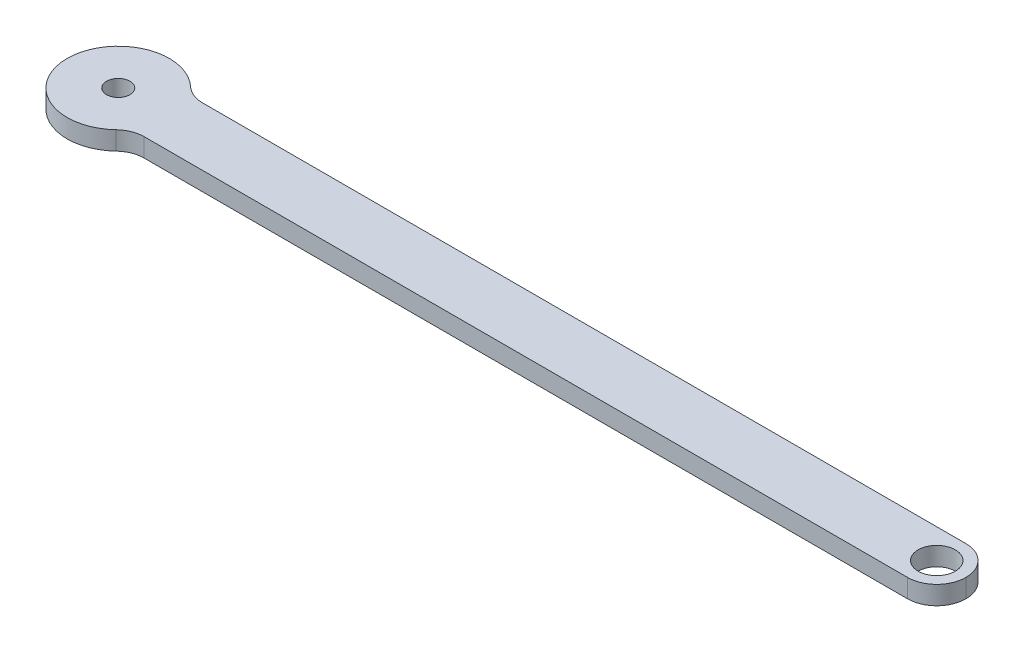
ISO-10303-21;
HEADER;
FILE_DESCRIPTION(('STEP AP214'),'2;1');
FILE_NAME('part.step','',(''),(''),'','','');
FILE_SCHEMA(('AUTOMOTIVE_DESIGN { 1 0 10303 214 1 1 1 1 }'));
ENDSEC;
DATA;
#1=APPLICATION_CONTEXT('core data for automotive mechanical design processes');
#2=APPLICATION_PROTOCOL_DEFINITION('international standard','automotive_design',2000,#1);
#3=PRODUCT_CONTEXT('',#1,'mechanical');
#4=PRODUCT('Part','Part','',(#3));
#5=PRODUCT_RELATED_PRODUCT_CATEGORY('part','',(#4));
#6=PRODUCT_DEFINITION_FORMATION('','',#4);
#7=PRODUCT_DEFINITION_CONTEXT('part definition',#1,'design');
#8=PRODUCT_DEFINITION('design','',#6,#7);
#9=PRODUCT_DEFINITION_SHAPE('','',#8);
#10=(LENGTH_UNIT() NAMED_UNIT(*) SI_UNIT(.MILLI.,.METRE.));
#11=(NAMED_UNIT(*) PLANE_ANGLE_UNIT() SI_UNIT($,.RADIAN.));
#12=(NAMED_UNIT(*) SI_UNIT($,.STERADIAN.) SOLID_ANGLE_UNIT());
#13=UNCERTAINTY_MEASURE_WITH_UNIT(LENGTH_MEASURE(1.E-05),#10,'distance_accuracy_value','');
#14=(GEOMETRIC_REPRESENTATION_CONTEXT(3) GLOBAL_UNCERTAINTY_ASSIGNED_CONTEXT((#13)) GLOBAL_UNIT_ASSIGNED_CONTEXT((#10,
#11,#12)) REPRESENTATION_CONTEXT('',''));
#15=CARTESIAN_POINT('',(0.,0.,0.));
#16=DIRECTION('',(0.,0.,1.));
#17=DIRECTION('',(1.,0.,0.));
#18=AXIS2_PLACEMENT_3D('',#15,#16,#17);
#19=CARTESIAN_POINT('',(-150.,6.35,10.));
#20=DIRECTION('',(0.,0.,-1.));
#21=DIRECTION('',(-1.,0.,0.));
#22=AXIS2_PLACEMENT_3D('',#19,#20,#21);
#23=PLANE('',#22);
#24=DIRECTION('',(1.,0.,0.));
#25=VECTOR('',#24,1.);
#26=CARTESIAN_POINT('',(-150.,6.35,10.));
#27=LINE('',#26,#25);
#28=CARTESIAN_POINT('',(-121.125413911823,6.35,10.));
#29=VERTEX_POINT('',#28);
#30=CARTESIAN_POINT('',(140.,6.35,10.));
#31=VERTEX_POINT('',#30);
#32=EDGE_CURVE('E126',#29,#31,#27,.T.);
#33=ORIENTED_EDGE('',*,*,#32,.F.);
#34=DIRECTION('',(0.,1.,0.));
#35=VECTOR('',#34,1.);
#36=CARTESIAN_POINT('',(-121.125413911823,6.35,10.));
#37=LINE('',#36,#35);
#38=CARTESIAN_POINT('',(-121.125413911823,0.,10.));
#39=VERTEX_POINT('',#38);
#40=EDGE_CURVE('E141',#29,#39,#37,.F.);
#41=ORIENTED_EDGE('',*,*,#40,.T.);
#42=DIRECTION('',(1.,0.,0.));
#43=VECTOR('',#42,1.);
#44=CARTESIAN_POINT('',(-150.,0.,10.));
#45=LINE('',#44,#43);
#46=CARTESIAN_POINT('',(140.,0.,10.));
#47=VERTEX_POINT('',#46);
#48=EDGE_CURVE('E127',#39,#47,#45,.T.);
#49=ORIENTED_EDGE('',*,*,#48,.T.);
#50=DIRECTION('',(0.,-1.,0.));
#51=VECTOR('',#50,1.);
#52=CARTESIAN_POINT('',(140.,6.35,10.));
#53=LINE('',#52,#51);
#54=EDGE_CURVE('E138',#47,#31,#53,.F.);
#55=ORIENTED_EDGE('',*,*,#54,.T.);
#56=EDGE_LOOP('',(#33,#41,#49,#55));
#57=FACE_BOUND('',#56,.T.);
#58=ADVANCED_FACE('F45',(#57),#23,.F.);
#59=CARTESIAN_POINT('',(-150.,6.35,-10.));
#60=DIRECTION('',(0.,0.,1.));
#61=DIRECTION('',(1.,0.,0.));
#62=AXIS2_PLACEMENT_3D('',#59,#60,#61);
#63=PLANE('',#62);
#64=DIRECTION('',(-1.,0.,0.));
#65=VECTOR('',#64,1.);
#66=CARTESIAN_POINT('',(-150.,0.,-10.));
#67=LINE('',#66,#65);
#68=CARTESIAN_POINT('',(140.,0.,-10.));
#69=VERTEX_POINT('',#68);
#70=CARTESIAN_POINT('',(-121.125413911823,0.,-10.));
#71=VERTEX_POINT('',#70);
#72=EDGE_CURVE('E118',#69,#71,#67,.T.);
#73=ORIENTED_EDGE('',*,*,#72,.T.);
#74=DIRECTION('',(0.,1.,0.));
#75=VECTOR('',#74,1.);
#76=CARTESIAN_POINT('',(-121.125413911823,6.35,-10.));
#77=LINE('',#76,#75);
#78=CARTESIAN_POINT('',(-121.125413911823,6.35,-10.));
#79=VERTEX_POINT('',#78);
#80=EDGE_CURVE('E151',#71,#79,#77,.T.);
#81=ORIENTED_EDGE('',*,*,#80,.T.);
#82=DIRECTION('',(-1.,0.,0.));
#83=VECTOR('',#82,1.);
#84=CARTESIAN_POINT('',(-150.,6.35,-10.));
#85=LINE('',#84,#83);
#86=CARTESIAN_POINT('',(140.,6.35,-10.));
#87=VERTEX_POINT('',#86);
#88=EDGE_CURVE('E120',#87,#79,#85,.T.);
#89=ORIENTED_EDGE('',*,*,#88,.F.);
#90=DIRECTION('',(0.,-1.,0.));
#91=VECTOR('',#90,1.);
#92=CARTESIAN_POINT('',(140.,6.35,-10.));
#93=LINE('',#92,#91);
#94=EDGE_CURVE('E108',#87,#69,#93,.T.);
#95=ORIENTED_EDGE('',*,*,#94,.T.);
#96=EDGE_LOOP('',(#73,#81,#89,#95));
#97=FACE_BOUND('',#96,.T.);
#98=ADVANCED_FACE('F117',(#97),#63,.F.);
#99=CARTESIAN_POINT('',(0.,6.35,0.));
#100=DIRECTION('',(0.,1.,0.));
#101=DIRECTION('',(0.,0.,1.));
#102=AXIS2_PLACEMENT_3D('',#99,#100,#101);
#103=PLANE('',#102);
#104=ORIENTED_EDGE('',*,*,#88,.T.);
#105=CARTESIAN_POINT('',(-121.125413911823,6.35,-20.));
#106=DIRECTION('',(0.,1.,0.));
#107=DIRECTION('',(0.,0.,1.));
#108=AXIS2_PLACEMENT_3D('',#105,#106,#107);
#109=CIRCLE('',#108,10.);
#110=CARTESIAN_POINT('',(-127.988899762069,6.35,-12.7272727272727));
#111=VERTEX_POINT('',#110);
#112=EDGE_CURVE('E53',#79,#111,#109,.F.);
#113=ORIENTED_EDGE('',*,*,#112,.T.);
#114=CARTESIAN_POINT('',(-140.,6.35,0.));
#115=DIRECTION('',(0.,1.,0.));
#116=DIRECTION('',(0.,0.,1.));
#117=AXIS2_PLACEMENT_3D('',#114,#115,#116);
#118=CIRCLE('',#117,17.5);
#119=CARTESIAN_POINT('',(-127.988899762069,6.35,12.7272727272727));
#120=VERTEX_POINT('',#119);
#121=EDGE_CURVE('E161',#111,#120,#118,.T.);
#122=ORIENTED_EDGE('',*,*,#121,.T.);
#123=CARTESIAN_POINT('',(-121.125413911823,6.35,20.));
#124=DIRECTION('',(0.,1.,0.));
#125=DIRECTION('',(0.,0.,1.));
#126=AXIS2_PLACEMENT_3D('',#123,#124,#125);
#127=CIRCLE('',#126,10.);
#128=EDGE_CURVE('E155',#120,#29,#127,.F.);
#129=ORIENTED_EDGE('',*,*,#128,.T.);
#130=ORIENTED_EDGE('',*,*,#32,.T.);
#131=CARTESIAN_POINT('',(140.,6.35,0.));
#132=DIRECTION('',(0.,1.,0.));
#133=DIRECTION('',(0.,0.,1.));
#134=AXIS2_PLACEMENT_3D('',#131,#132,#133);
#135=CIRCLE('',#134,10.);
#136=CARTESIAN_POINT('',(150.,6.35,0.));
#137=VERTEX_POINT('',#136);
#138=EDGE_CURVE('E121',#31,#137,#135,.T.);
#139=ORIENTED_EDGE('',*,*,#138,.T.);
#140=CARTESIAN_POINT('',(140.,6.35,0.));
#141=DIRECTION('',(0.,1.,0.));
#142=DIRECTION('',(0.,0.,1.));
#143=AXIS2_PLACEMENT_3D('',#140,#141,#142);
#144=CIRCLE('',#143,10.);
#145=EDGE_CURVE('E136',#137,#87,#144,.T.);
#146=ORIENTED_EDGE('',*,*,#145,.T.);
#147=EDGE_LOOP('',(#104,#113,#122,#129,#130,#139,#146));
#148=FACE_BOUND('',#147,.T.);
#149=CARTESIAN_POINT('',(140.,6.35,0.));
#150=DIRECTION('',(0.,1.,0.));
#151=DIRECTION('',(0.,0.,1.));
#152=AXIS2_PLACEMENT_3D('',#149,#150,#151);
#153=CIRCLE('',#152,6.35);
#154=CARTESIAN_POINT('',(140.,6.35,6.35));
#155=VERTEX_POINT('',#154);
#156=EDGE_CURVE('E130',#155,#155,#153,.T.);
#157=ORIENTED_EDGE('',*,*,#156,.F.);
#158=EDGE_LOOP('',(#157));
#159=FACE_BOUND('',#158,.T.);
#160=CARTESIAN_POINT('',(-140.,6.35,0.));
#161=DIRECTION('',(0.,1.,0.));
#162=DIRECTION('',(0.,0.,1.));
#163=AXIS2_PLACEMENT_3D('',#160,#161,#162);
#164=CIRCLE('',#163,3.99999999999999);
#165=CARTESIAN_POINT('',(-140.,6.35,3.99999999999999));
#166=VERTEX_POINT('',#165);
#167=EDGE_CURVE('E168',#166,#166,#164,.T.);
#168=ORIENTED_EDGE('',*,*,#167,.F.);
#169=EDGE_LOOP('',(#168));
#170=FACE_BOUND('',#169,.T.);
#171=ADVANCED_FACE('F159',(#148,#159,#170),#103,.T.);
#172=CARTESIAN_POINT('',(0.,0.,0.));
#173=DIRECTION('',(0.,1.,0.));
#174=DIRECTION('',(0.,0.,1.));
#175=AXIS2_PLACEMENT_3D('',#172,#173,#174);
#176=PLANE('',#175);
#177=ORIENTED_EDGE('',*,*,#48,.F.);
#178=CARTESIAN_POINT('',(-121.125413911823,0.,20.));
#179=DIRECTION('',(0.,1.,0.));
#180=DIRECTION('',(0.,0.,1.));
#181=AXIS2_PLACEMENT_3D('',#178,#179,#180);
#182=CIRCLE('',#181,10.);
#183=CARTESIAN_POINT('',(-127.988899762069,0.,12.7272727272727));
#184=VERTEX_POINT('',#183);
#185=EDGE_CURVE('E153',#39,#184,#182,.T.);
#186=ORIENTED_EDGE('',*,*,#185,.T.);
#187=CARTESIAN_POINT('',(-140.,0.,0.));
#188=DIRECTION('',(0.,1.,0.));
#189=DIRECTION('',(0.,0.,1.));
#190=AXIS2_PLACEMENT_3D('',#187,#188,#189);
#191=CIRCLE('',#190,17.5);
#192=CARTESIAN_POINT('',(-127.988899762069,0.,-12.7272727272727));
#193=VERTEX_POINT('',#192);
#194=EDGE_CURVE('E167',#184,#193,#191,.F.);
#195=ORIENTED_EDGE('',*,*,#194,.T.);
#196=CARTESIAN_POINT('',(-121.125413911823,0.,-20.));
#197=DIRECTION('',(0.,1.,0.));
#198=DIRECTION('',(0.,0.,1.));
#199=AXIS2_PLACEMENT_3D('',#196,#197,#198);
#200=CIRCLE('',#199,10.);
#201=EDGE_CURVE('E13',#193,#71,#200,.T.);
#202=ORIENTED_EDGE('',*,*,#201,.T.);
#203=ORIENTED_EDGE('',*,*,#72,.F.);
#204=CARTESIAN_POINT('',(140.,0.,0.));
#205=DIRECTION('',(0.,1.,0.));
#206=DIRECTION('',(0.,0.,1.));
#207=AXIS2_PLACEMENT_3D('',#204,#205,#206);
#208=CIRCLE('',#207,10.);
#209=CARTESIAN_POINT('',(150.,0.,0.));
#210=VERTEX_POINT('',#209);
#211=EDGE_CURVE('E104',#69,#210,#208,.F.);
#212=ORIENTED_EDGE('',*,*,#211,.T.);
#213=CARTESIAN_POINT('',(140.,0.,0.));
#214=DIRECTION('',(0.,1.,0.));
#215=DIRECTION('',(0.,0.,1.));
#216=AXIS2_PLACEMENT_3D('',#213,#214,#215);
#217=CIRCLE('',#216,10.);
#218=EDGE_CURVE('E113',#210,#47,#217,.F.);
#219=ORIENTED_EDGE('',*,*,#218,.T.);
#220=EDGE_LOOP('',(#177,#186,#195,#202,#203,#212,#219));
#221=FACE_BOUND('',#220,.T.);
#222=CARTESIAN_POINT('',(140.,0.,0.));
#223=DIRECTION('',(0.,1.,0.));
#224=DIRECTION('',(0.,0.,-1.));
#225=AXIS2_PLACEMENT_3D('',#222,#223,#224);
#226=CIRCLE('',#225,6.35);
#227=CARTESIAN_POINT('',(140.,0.,-6.35));
#228=VERTEX_POINT('',#227);
#229=EDGE_CURVE('E143',#228,#228,#226,.T.);
#230=ORIENTED_EDGE('',*,*,#229,.T.);
#231=EDGE_LOOP('',(#230));
#232=FACE_BOUND('',#231,.T.);
#233=CARTESIAN_POINT('',(-140.,0.,0.));
#234=DIRECTION('',(0.,1.,0.));
#235=DIRECTION('',(0.,0.,1.));
#236=AXIS2_PLACEMENT_3D('',#233,#234,#235);
#237=CIRCLE('',#236,3.99999999999999);
#238=CARTESIAN_POINT('',(-140.,0.,3.99999999999999));
#239=VERTEX_POINT('',#238);
#240=EDGE_CURVE('E144',#239,#239,#237,.F.);
#241=ORIENTED_EDGE('',*,*,#240,.F.);
#242=EDGE_LOOP('',(#241));
#243=FACE_BOUND('',#242,.T.);
#244=ADVANCED_FACE('F124',(#221,#232,#243),#176,.F.);
#245=CARTESIAN_POINT('',(140.,24.3105122421383,0.));
#246=DIRECTION('',(0.,-1.,0.));
#247=DIRECTION('',(0.,0.,-1.));
#248=AXIS2_PLACEMENT_3D('',#245,#246,#247);
#249=CYLINDRICAL_SURFACE('',#248,6.35);
#250=ORIENTED_EDGE('',*,*,#229,.F.);
#251=EDGE_LOOP('',(#250));
#252=FACE_BOUND('',#251,.T.);
#253=ORIENTED_EDGE('',*,*,#156,.T.);
#254=EDGE_LOOP('',(#253));
#255=FACE_BOUND('',#254,.T.);
#256=ADVANCED_FACE('F191',(#252,#255),#249,.F.);
#257=CARTESIAN_POINT('',(140.,6.35,0.));
#258=DIRECTION('',(0.,-1.,0.));
#259=DIRECTION('',(0.,0.,-1.));
#260=AXIS2_PLACEMENT_3D('',#257,#258,#259);
#261=CYLINDRICAL_SURFACE('',#260,10.);
#262=DIRECTION('',(0.,-1.,0.));
#263=VECTOR('',#262,1.);
#264=CARTESIAN_POINT('',(150.,6.35,0.));
#265=LINE('',#264,#263);
#266=EDGE_CURVE('E110',#137,#210,#265,.T.);
#267=ORIENTED_EDGE('',*,*,#266,.F.);
#268=ORIENTED_EDGE('',*,*,#138,.F.);
#269=ORIENTED_EDGE('',*,*,#54,.F.);
#270=ORIENTED_EDGE('',*,*,#218,.F.);
#271=EDGE_LOOP('',(#267,#268,#269,#270));
#272=FACE_BOUND('',#271,.T.);
#273=ADVANCED_FACE('F189',(#272),#261,.T.);
#274=CARTESIAN_POINT('',(140.,6.35,0.));
#275=DIRECTION('',(0.,-1.,0.));
#276=DIRECTION('',(0.,0.,-1.));
#277=AXIS2_PLACEMENT_3D('',#274,#275,#276);
#278=CYLINDRICAL_SURFACE('',#277,10.);
#279=ORIENTED_EDGE('',*,*,#145,.F.);
#280=ORIENTED_EDGE('',*,*,#266,.T.);
#281=ORIENTED_EDGE('',*,*,#211,.F.);
#282=ORIENTED_EDGE('',*,*,#94,.F.);
#283=EDGE_LOOP('',(#279,#280,#281,#282));
#284=FACE_BOUND('',#283,.T.);
#285=ADVANCED_FACE('F107',(#284),#278,.T.);
#286=CARTESIAN_POINT('',(-140.,-49.4974746830584,0.));
#287=DIRECTION('',(0.,1.,0.));
#288=DIRECTION('',(0.,0.,1.));
#289=AXIS2_PLACEMENT_3D('',#286,#287,#288);
#290=CYLINDRICAL_SURFACE('',#289,17.5);
#291=ORIENTED_EDGE('',*,*,#194,.F.);
#292=DIRECTION('',(0.,1.,0.));
#293=VECTOR('',#292,1.);
#294=CARTESIAN_POINT('',(-127.988899762069,-49.4974746830584,12.7272727272727));
#295=LINE('',#294,#293);
#296=EDGE_CURVE('E149',#184,#120,#295,.T.);
#297=ORIENTED_EDGE('',*,*,#296,.T.);
#298=ORIENTED_EDGE('',*,*,#121,.F.);
#299=DIRECTION('',(0.,1.,0.));
#300=VECTOR('',#299,1.);
#301=CARTESIAN_POINT('',(-127.988899762069,-49.4974746830584,-12.7272727272727));
#302=LINE('',#301,#300);
#303=EDGE_CURVE('E147',#111,#193,#302,.F.);
#304=ORIENTED_EDGE('',*,*,#303,.T.);
#305=EDGE_LOOP('',(#291,#297,#298,#304));
#306=FACE_BOUND('',#305,.T.);
#307=ADVANCED_FACE('F165',(#306),#290,.T.);
#308=CARTESIAN_POINT('',(-140.,-49.4974746830584,0.));
#309=DIRECTION('',(0.,1.,0.));
#310=DIRECTION('',(0.,0.,1.));
#311=AXIS2_PLACEMENT_3D('',#308,#309,#310);
#312=CYLINDRICAL_SURFACE('',#311,3.99999999999999);
#313=ORIENTED_EDGE('',*,*,#240,.T.);
#314=EDGE_LOOP('',(#313));
#315=FACE_BOUND('',#314,.T.);
#316=ORIENTED_EDGE('',*,*,#167,.T.);
#317=EDGE_LOOP('',(#316));
#318=FACE_BOUND('',#317,.T.);
#319=ADVANCED_FACE('F175',(#315,#318),#312,.F.);
#320=CARTESIAN_POINT('',(-121.125413911823,-49.4974746830584,20.));
#321=DIRECTION('',(0.,1.,0.));
#322=DIRECTION('',(0.,0.,1.));
#323=AXIS2_PLACEMENT_3D('',#320,#321,#322);
#324=CYLINDRICAL_SURFACE('',#323,10.);
#325=ORIENTED_EDGE('',*,*,#128,.F.);
#326=ORIENTED_EDGE('',*,*,#296,.F.);
#327=ORIENTED_EDGE('',*,*,#185,.F.);
#328=ORIENTED_EDGE('',*,*,#40,.F.);
#329=EDGE_LOOP('',(#325,#326,#327,#328));
#330=FACE_BOUND('',#329,.T.);
#331=ADVANCED_FACE('F171',(#330),#324,.F.);
#332=CARTESIAN_POINT('',(-121.125413911823,-49.4974746830584,-20.));
#333=DIRECTION('',(0.,1.,0.));
#334=DIRECTION('',(0.,0.,1.));
#335=AXIS2_PLACEMENT_3D('',#332,#333,#334);
#336=CYLINDRICAL_SURFACE('',#335,10.);
#337=ORIENTED_EDGE('',*,*,#201,.F.);
#338=ORIENTED_EDGE('',*,*,#303,.F.);
#339=ORIENTED_EDGE('',*,*,#112,.F.);
#340=ORIENTED_EDGE('',*,*,#80,.F.);
#341=EDGE_LOOP('',(#337,#338,#339,#340));
#342=FACE_BOUND('',#341,.T.);
#343=ADVANCED_FACE('F47',(#342),#336,.F.);
#344=CLOSED_SHELL('',(#58,#98,#171,#244,#256,#273,#285,#307,#319,#331,#343));
#345=MANIFOLD_SOLID_BREP('B2',#344);
#346=ADVANCED_BREP_SHAPE_REPRESENTATION('',(#18,#345),#14);
#347=SHAPE_DEFINITION_REPRESENTATION(#9,#346);
ENDSEC;
END-ISO-10303-21;
